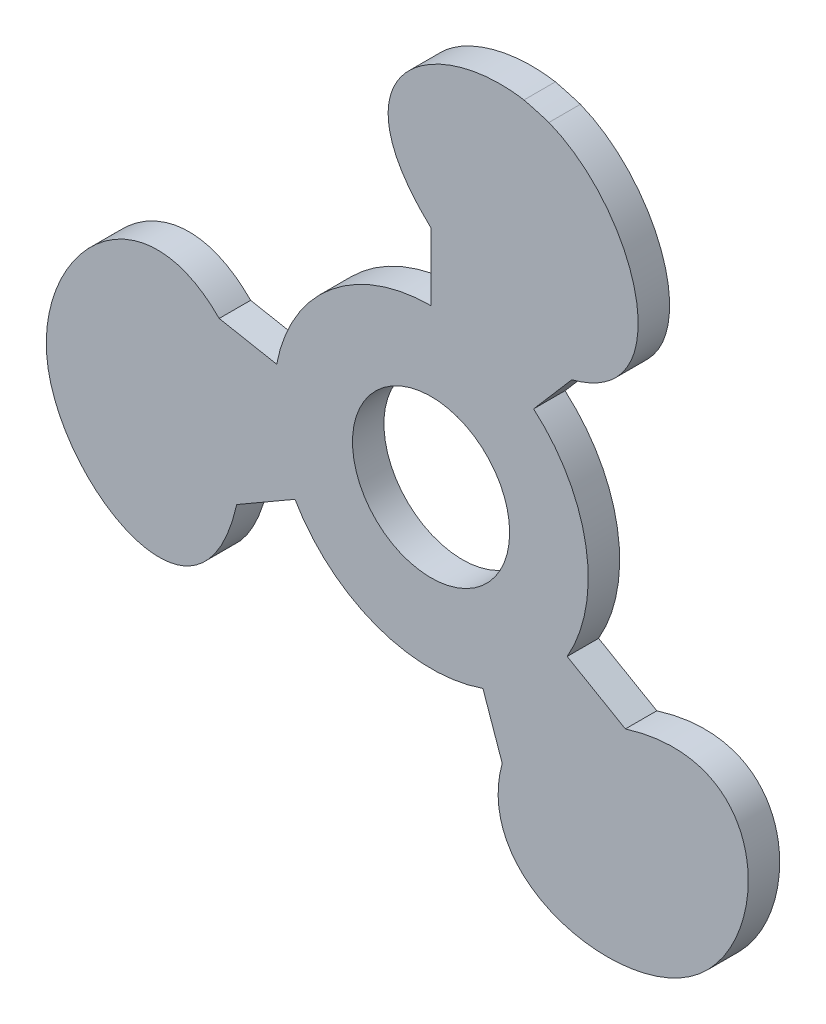
ISO-10303-21;
HEADER;
FILE_DESCRIPTION(('STEP AP214'),'2;1');
FILE_NAME('part.step','',(''),(''),'','','');
FILE_SCHEMA(('AUTOMOTIVE_DESIGN { 1 0 10303 214 1 1 1 1 }'));
ENDSEC;
DATA;
#1=APPLICATION_CONTEXT('core data for automotive mechanical design processes');
#2=APPLICATION_PROTOCOL_DEFINITION('international standard','automotive_design',2000,#1);
#3=PRODUCT_CONTEXT('',#1,'mechanical');
#4=PRODUCT('Part','Part','',(#3));
#5=PRODUCT_RELATED_PRODUCT_CATEGORY('part','',(#4));
#6=PRODUCT_DEFINITION_FORMATION('','',#4);
#7=PRODUCT_DEFINITION_CONTEXT('part definition',#1,'design');
#8=PRODUCT_DEFINITION('design','',#6,#7);
#9=PRODUCT_DEFINITION_SHAPE('','',#8);
#10=(LENGTH_UNIT() NAMED_UNIT(*) SI_UNIT(.MILLI.,.METRE.));
#11=(NAMED_UNIT(*) PLANE_ANGLE_UNIT() SI_UNIT($,.RADIAN.));
#12=(NAMED_UNIT(*) SI_UNIT($,.STERADIAN.) SOLID_ANGLE_UNIT());
#13=UNCERTAINTY_MEASURE_WITH_UNIT(LENGTH_MEASURE(1.E-05),#10,'distance_accuracy_value','');
#14=(GEOMETRIC_REPRESENTATION_CONTEXT(3) GLOBAL_UNCERTAINTY_ASSIGNED_CONTEXT((#13)) GLOBAL_UNIT_ASSIGNED_CONTEXT((#10,
#11,#12)) REPRESENTATION_CONTEXT('',''));
#15=CARTESIAN_POINT('',(0.,0.,0.));
#16=DIRECTION('',(0.,0.,1.));
#17=DIRECTION('',(1.,0.,0.));
#18=AXIS2_PLACEMENT_3D('',#15,#16,#17);
#19=CARTESIAN_POINT('',(-12.3652752127292,-7.13909497267301,2.));
#20=CARTESIAN_POINT('',(-14.5541537124351,-16.7940340003623,2.));
#21=CARTESIAN_POINT('',(-32.1296212357501,-6.76288989126732,2.));
#22=CARTESIAN_POINT('',(-18.6748872451603,7.80691112905887,2.));
#23=CARTESIAN_POINT('',(-13.4821589356845,2.5563717386839,2.));
#24=B_SPLINE_CURVE_WITH_KNOTS('',3,(#19,#20,#21,#22,#23),.UNSPECIFIED.,.F.,.F.,(4,1,4),(0.,
0.508066185754946,1.),.UNSPECIFIED.);
#25=DIRECTION('',(0.,0.,-1.));
#26=VECTOR('',#25,1.);
#27=SURFACE_OF_LINEAR_EXTRUSION('',#24,#26);
#28=CARTESIAN_POINT('',(-12.3652752127292,-7.13909497267301,0.));
#29=CARTESIAN_POINT('',(-14.5541537124351,-16.7940340003623,0.));
#30=CARTESIAN_POINT('',(-32.1296212357501,-6.76288989126732,0.));
#31=CARTESIAN_POINT('',(-18.6748872451603,7.80691112905887,0.));
#32=CARTESIAN_POINT('',(-13.4821589356845,2.5563717386839,0.));
#33=B_SPLINE_CURVE_WITH_KNOTS('',3,(#28,#29,#30,#31,#32),.UNSPECIFIED.,.F.,.F.,(4,1,4),(0.,
0.508066185754946,1.),.UNSPECIFIED.);
#34=CARTESIAN_POINT('',(-12.3652752127292,-7.13909497267301,0.));
#35=VERTEX_POINT('',#34);
#36=CARTESIAN_POINT('',(-13.4821589356845,2.5563717386839,0.));
#37=VERTEX_POINT('',#36);
#38=EDGE_CURVE('E151',#35,#37,#33,.T.);
#39=ORIENTED_EDGE('',*,*,#38,.F.);
#40=DIRECTION('',(0.,0.,-1.));
#41=VECTOR('',#40,1.);
#42=CARTESIAN_POINT('',(-12.3652752127292,-7.13909497267301,2.));
#43=LINE('',#42,#41);
#44=CARTESIAN_POINT('',(-12.3652752127292,-7.13909497267301,2.));
#45=VERTEX_POINT('',#44);
#46=EDGE_CURVE('E11',#45,#35,#43,.T.);
#47=ORIENTED_EDGE('',*,*,#46,.F.);
#48=CARTESIAN_POINT('',(-13.4821589356845,2.5563717386839,2.));
#49=VERTEX_POINT('',#48);
#50=EDGE_CURVE('E146',#45,#49,#24,.T.);
#51=ORIENTED_EDGE('',*,*,#50,.T.);
#52=DIRECTION('',(0.,0.,-1.));
#53=VECTOR('',#52,1.);
#54=CARTESIAN_POINT('',(-13.4821589356845,2.5563717386839,2.));
#55=LINE('',#54,#53);
#56=EDGE_CURVE('E358',#49,#37,#55,.T.);
#57=ORIENTED_EDGE('',*,*,#56,.T.);
#58=EDGE_LOOP('',(#39,#47,#51,#57));
#59=FACE_BOUND('',#58,.T.);
#60=ADVANCED_FACE('F35',(#59),#27,.T.);
#61=CARTESIAN_POINT('',(0.,0.,2.));
#62=DIRECTION('',(0.5,-0.866025403784439,0.));
#63=DIRECTION('',(0.866025403784439,0.5,0.));
#64=AXIS2_PLACEMENT_3D('',#61,#62,#63);
#65=PLANE('',#64);
#66=DIRECTION('',(0.,0.,1.));
#67=VECTOR('',#66,1.);
#68=CARTESIAN_POINT('',(-8.66025403784439,-5.,0.));
#69=LINE('',#68,#67);
#70=CARTESIAN_POINT('',(-8.66025403784439,-5.,2.));
#71=VERTEX_POINT('',#70);
#72=CARTESIAN_POINT('',(-8.66025403784439,-5.,0.));
#73=VERTEX_POINT('',#72);
#74=EDGE_CURVE('E140',#71,#73,#69,.F.);
#75=ORIENTED_EDGE('',*,*,#74,.F.);
#76=DIRECTION('',(-0.866025403784439,-0.5,0.));
#77=VECTOR('',#76,1.);
#78=CARTESIAN_POINT('',(0.,0.,2.));
#79=LINE('',#78,#77);
#80=EDGE_CURVE('E135',#71,#45,#79,.T.);
#81=ORIENTED_EDGE('',*,*,#80,.T.);
#82=ORIENTED_EDGE('',*,*,#46,.T.);
#83=DIRECTION('',(-0.866025403784439,-0.5,0.));
#84=VECTOR('',#83,1.);
#85=CARTESIAN_POINT('',(0.,0.,0.));
#86=LINE('',#85,#84);
#87=EDGE_CURVE('E362',#73,#35,#86,.T.);
#88=ORIENTED_EDGE('',*,*,#87,.F.);
#89=EDGE_LOOP('',(#75,#81,#82,#88));
#90=FACE_BOUND('',#89,.T.);
#91=ADVANCED_FACE('F137',(#90),#65,.T.);
#92=CARTESIAN_POINT('',(0.,0.,2.));
#93=DIRECTION('',(-0.944011192247635,-0.329913426388195,0.));
#94=DIRECTION('',(0.329913426388196,-0.944011192247635,0.));
#95=AXIS2_PLACEMENT_3D('',#92,#93,#94);
#96=PLANE('',#95);
#97=DIRECTION('',(0.,0.,1.));
#98=VECTOR('',#97,1.);
#99=CARTESIAN_POINT('',(3.29913426388195,-9.44011192247635,0.));
#100=LINE('',#99,#98);
#101=CARTESIAN_POINT('',(3.29913426388195,-9.44011192247635,0.));
#102=VERTEX_POINT('',#101);
#103=CARTESIAN_POINT('',(3.29913426388195,-9.44011192247635,2.));
#104=VERTEX_POINT('',#103);
#105=EDGE_CURVE('E414',#102,#104,#100,.T.);
#106=ORIENTED_EDGE('',*,*,#105,.F.);
#107=DIRECTION('',(-0.329913426388196,0.944011192247635,0.));
#108=VECTOR('',#107,1.);
#109=CARTESIAN_POINT('',(0.,0.,0.));
#110=LINE('',#109,#108);
#111=CARTESIAN_POINT('',(4.5271966006254,-12.9540780055041,0.));
#112=VERTEX_POINT('',#111);
#113=EDGE_CURVE('E367',#112,#102,#110,.T.);
#114=ORIENTED_EDGE('',*,*,#113,.F.);
#115=DIRECTION('',(0.,0.,-1.));
#116=VECTOR('',#115,1.);
#117=CARTESIAN_POINT('',(4.5271966006254,-12.9540780055041,2.));
#118=LINE('',#117,#116);
#119=CARTESIAN_POINT('',(4.5271966006254,-12.9540780055041,2.));
#120=VERTEX_POINT('',#119);
#121=EDGE_CURVE('E43',#120,#112,#118,.T.);
#122=ORIENTED_EDGE('',*,*,#121,.F.);
#123=DIRECTION('',(-0.329913426388196,0.944011192247635,0.));
#124=VECTOR('',#123,1.);
#125=CARTESIAN_POINT('',(0.,0.,2.));
#126=LINE('',#125,#124);
#127=EDGE_CURVE('E145',#120,#104,#126,.T.);
#128=ORIENTED_EDGE('',*,*,#127,.T.);
#129=EDGE_LOOP('',(#106,#114,#122,#128));
#130=FACE_BOUND('',#129,.T.);
#131=ADVANCED_FACE('F185',(#130),#96,.T.);
#132=CARTESIAN_POINT('',(12.3652752127292,-7.13909497267302,2.));
#133=CARTESIAN_POINT('',(21.821136932551,-4.20724984537113,2.));
#134=CARTESIAN_POINT('',(21.9216450667096,-24.4436232584978,2.));
#135=CARTESIAN_POINT('',(2.57646025972784,-20.0763823316482,2.));
#136=CARTESIAN_POINT('',(4.5271966006254,-12.9540780055041,2.));
#137=B_SPLINE_CURVE_WITH_KNOTS('',3,(#132,#133,#134,#135,#136),.UNSPECIFIED.,.F.,.F.,(4,1,4),
(0.,0.508066185754946,1.),.UNSPECIFIED.);
#138=DIRECTION('',(0.,0.,-1.));
#139=VECTOR('',#138,1.);
#140=SURFACE_OF_LINEAR_EXTRUSION('',#137,#139);
#141=CARTESIAN_POINT('',(12.3652752127292,-7.13909497267302,0.));
#142=CARTESIAN_POINT('',(21.821136932551,-4.20724984537113,0.));
#143=CARTESIAN_POINT('',(21.9216450667096,-24.4436232584978,0.));
#144=CARTESIAN_POINT('',(2.57646025972784,-20.0763823316482,0.));
#145=CARTESIAN_POINT('',(4.5271966006254,-12.9540780055041,0.));
#146=B_SPLINE_CURVE_WITH_KNOTS('',3,(#141,#142,#143,#144,#145),.UNSPECIFIED.,.F.,.F.,(4,1,4),
(0.,0.508066185754946,1.),.UNSPECIFIED.);
#147=CARTESIAN_POINT('',(12.3652752127292,-7.13909497267302,0.));
#148=VERTEX_POINT('',#147);
#149=EDGE_CURVE('E370',#148,#112,#146,.T.);
#150=ORIENTED_EDGE('',*,*,#149,.F.);
#151=DIRECTION('',(0.,0.,-1.));
#152=VECTOR('',#151,1.);
#153=CARTESIAN_POINT('',(12.3652752127292,-7.13909497267302,2.));
#154=LINE('',#153,#152);
#155=CARTESIAN_POINT('',(12.3652752127292,-7.13909497267302,2.));
#156=VERTEX_POINT('',#155);
#157=EDGE_CURVE('E406',#156,#148,#154,.T.);
#158=ORIENTED_EDGE('',*,*,#157,.F.);
#159=EDGE_CURVE('E168',#156,#120,#137,.T.);
#160=ORIENTED_EDGE('',*,*,#159,.T.);
#161=ORIENTED_EDGE('',*,*,#121,.T.);
#162=EDGE_LOOP('',(#150,#158,#160,#161));
#163=FACE_BOUND('',#162,.T.);
#164=ADVANCED_FACE('F180',(#163),#140,.T.);
#165=CARTESIAN_POINT('',(0.,0.,2.));
#166=DIRECTION('',(0.5,0.866025403784438,0.));
#167=DIRECTION('',(-0.866025403784438,0.5,0.));
#168=AXIS2_PLACEMENT_3D('',#165,#166,#167);
#169=PLANE('',#168);
#170=DIRECTION('',(0.,0.,1.));
#171=VECTOR('',#170,1.);
#172=CARTESIAN_POINT('',(8.66025403784439,-5.,0.));
#173=LINE('',#172,#171);
#174=CARTESIAN_POINT('',(8.66025403784439,-5.,2.));
#175=VERTEX_POINT('',#174);
#176=CARTESIAN_POINT('',(8.66025403784439,-5.,0.));
#177=VERTEX_POINT('',#176);
#178=EDGE_CURVE('E427',#175,#177,#173,.F.);
#179=ORIENTED_EDGE('',*,*,#178,.F.);
#180=DIRECTION('',(0.866025403784438,-0.5,0.));
#181=VECTOR('',#180,1.);
#182=CARTESIAN_POINT('',(0.,0.,2.));
#183=LINE('',#182,#181);
#184=EDGE_CURVE('E174',#175,#156,#183,.T.);
#185=ORIENTED_EDGE('',*,*,#184,.T.);
#186=ORIENTED_EDGE('',*,*,#157,.T.);
#187=DIRECTION('',(0.866025403784438,-0.5,0.));
#188=VECTOR('',#187,1.);
#189=CARTESIAN_POINT('',(0.,0.,0.));
#190=LINE('',#189,#188);
#191=EDGE_CURVE('E375',#177,#148,#190,.T.);
#192=ORIENTED_EDGE('',*,*,#191,.F.);
#193=EDGE_LOOP('',(#179,#185,#186,#192));
#194=FACE_BOUND('',#193,.T.);
#195=ADVANCED_FACE('F184',(#194),#169,.T.);
#196=CARTESIAN_POINT('',(4.45592768412916E-13,-3.83764106767014E-13,2.));
#197=DIRECTION('',(0.75771900442559,-0.652580960749157,0.));
#198=DIRECTION('',(0.652580960749157,0.75771900442559,0.));
#199=AXIS2_PLACEMENT_3D('',#196,#197,#198);
#200=PLANE('',#199);
#201=DIRECTION('',(0.,0.,1.));
#202=VECTOR('',#201,1.);
#203=CARTESIAN_POINT('',(6.52580960749202,7.57719004425552,0.));
#204=LINE('',#203,#202);
#205=CARTESIAN_POINT('',(6.52580960749202,7.57719004425552,0.));
#206=VERTEX_POINT('',#205);
#207=CARTESIAN_POINT('',(6.52580960749202,7.57719004425552,2.));
#208=VERTEX_POINT('',#207);
#209=EDGE_CURVE('E428',#206,#208,#204,.T.);
#210=ORIENTED_EDGE('',*,*,#209,.F.);
#211=DIRECTION('',(-0.652580960749157,-0.75771900442559,0.));
#212=VECTOR('',#211,1.);
#213=CARTESIAN_POINT('',(4.45592768412916E-13,-3.83764106767014E-13,0.));
#214=LINE('',#213,#212);
#215=CARTESIAN_POINT('',(8.95496233505911,10.3977062668202,0.));
#216=VERTEX_POINT('',#215);
#217=EDGE_CURVE('E380',#216,#206,#214,.T.);
#218=ORIENTED_EDGE('',*,*,#217,.F.);
#219=DIRECTION('',(0.,0.,-1.));
#220=VECTOR('',#219,1.);
#221=CARTESIAN_POINT('',(8.95496233505911,10.3977062668202,2.));
#222=LINE('',#221,#220);
#223=CARTESIAN_POINT('',(8.95496233505911,10.3977062668202,2.));
#224=VERTEX_POINT('',#223);
#225=EDGE_CURVE('E404',#224,#216,#222,.T.);
#226=ORIENTED_EDGE('',*,*,#225,.F.);
#227=DIRECTION('',(-0.652580960749157,-0.75771900442559,0.));
#228=VECTOR('',#227,1.);
#229=CARTESIAN_POINT('',(4.45592768412916E-13,-3.83764106767014E-13,2.));
#230=LINE('',#229,#228);
#231=EDGE_CURVE('E349',#224,#208,#230,.T.);
#232=ORIENTED_EDGE('',*,*,#231,.T.);
#233=EDGE_LOOP('',(#210,#218,#226,#232));
#234=FACE_BOUND('',#233,.T.);
#235=ADVANCED_FACE('F217',(#234),#200,.T.);
#236=CARTESIAN_POINT('',(0.,14.278189945346,2.));
#237=CARTESIAN_POINT('',(-7.26698322011607,21.0012838457335,2.));
#238=CARTESIAN_POINT('',(10.2079761690403,31.2065131497653,2.));
#239=CARTESIAN_POINT('',(16.0984269854324,12.2694712025896,2.));
#240=CARTESIAN_POINT('',(8.95496233505912,10.3977062668202,2.));
#241=B_SPLINE_CURVE_WITH_KNOTS('',3,(#236,#237,#238,#239,#240),.UNSPECIFIED.,.F.,.F.,(4,1,4),
(0.,0.508066185754947,1.),.UNSPECIFIED.);
#242=DIRECTION('',(0.,0.,-1.));
#243=VECTOR('',#242,1.);
#244=SURFACE_OF_LINEAR_EXTRUSION('',#241,#243);
#245=CARTESIAN_POINT('',(0.,14.278189945346,0.));
#246=CARTESIAN_POINT('',(-7.26698322011607,21.0012838457335,0.));
#247=CARTESIAN_POINT('',(10.2079761690403,31.2065131497653,0.));
#248=CARTESIAN_POINT('',(16.0984269854324,12.2694712025896,0.));
#249=CARTESIAN_POINT('',(8.95496233505912,10.3977062668202,0.));
#250=B_SPLINE_CURVE_WITH_KNOTS('',3,(#245,#246,#247,#248,#249),.UNSPECIFIED.,.F.,.F.,(4,1,4),
(0.,0.508066185754947,1.),.UNSPECIFIED.);
#251=CARTESIAN_POINT('',(7.49956503784142,23.8486168203354,0.));
#252=VERTEX_POINT('',#251);
#253=EDGE_CURVE('E383',#252,#216,#250,.T.);
#254=ORIENTED_EDGE('',*,*,#253,.F.);
#255=DIRECTION('',(0.,0.,-1.));
#256=VECTOR('',#255,1.);
#257=CARTESIAN_POINT('',(7.49956503784142,23.8486168203354,2.));
#258=LINE('',#257,#256);
#259=CARTESIAN_POINT('',(7.49956503784142,23.8486168203354,2.));
#260=VERTEX_POINT('',#259);
#261=EDGE_CURVE('E402',#260,#252,#258,.T.);
#262=ORIENTED_EDGE('',*,*,#261,.F.);
#263=EDGE_CURVE('E342',#260,#224,#241,.T.);
#264=ORIENTED_EDGE('',*,*,#263,.T.);
#265=ORIENTED_EDGE('',*,*,#225,.T.);
#266=EDGE_LOOP('',(#254,#262,#264,#265));
#267=FACE_BOUND('',#266,.T.);
#268=ADVANCED_FACE('F211',(#267),#244,.T.);
#269=CARTESIAN_POINT('',(0.,0.,2.));
#270=DIRECTION('',(0.,0.,-1.));
#271=DIRECTION('',(-1.,0.,0.));
#272=AXIS2_PLACEMENT_3D('',#269,#270,#271);
#273=CYLINDRICAL_SURFACE('',#272,25.);
#274=CARTESIAN_POINT('',(0.,0.,0.));
#275=DIRECTION('',(0.,0.,1.));
#276=DIRECTION('',(1.,0.,0.));
#277=AXIS2_PLACEMENT_3D('',#274,#275,#276);
#278=CIRCLE('',#277,25.);
#279=CARTESIAN_POINT('',(5.90962921394711,24.2914858037474,0.));
#280=VERTEX_POINT('',#279);
#281=EDGE_CURVE('E388',#252,#280,#278,.T.);
#282=ORIENTED_EDGE('',*,*,#281,.T.);
#283=DIRECTION('',(0.,0.,-1.));
#284=VECTOR('',#283,1.);
#285=CARTESIAN_POINT('',(5.90962921394711,24.2914858037474,2.));
#286=LINE('',#285,#284);
#287=CARTESIAN_POINT('',(5.90962921394711,24.2914858037474,2.));
#288=VERTEX_POINT('',#287);
#289=EDGE_CURVE('E400',#288,#280,#286,.T.);
#290=ORIENTED_EDGE('',*,*,#289,.F.);
#291=CARTESIAN_POINT('',(0.,0.,2.));
#292=DIRECTION('',(0.,0.,1.));
#293=DIRECTION('',(1.,0.,0.));
#294=AXIS2_PLACEMENT_3D('',#291,#292,#293);
#295=CIRCLE('',#294,25.);
#296=EDGE_CURVE('E348',#260,#288,#295,.T.);
#297=ORIENTED_EDGE('',*,*,#296,.F.);
#298=ORIENTED_EDGE('',*,*,#261,.T.);
#299=EDGE_LOOP('',(#282,#290,#297,#298));
#300=FACE_BOUND('',#299,.T.);
#301=ADVANCED_FACE('F216',(#300),#273,.T.);
#302=CARTESIAN_POINT('',(0.,14.2781899453455,0.));
#303=VERTEX_POINT('',#302);
#304=EDGE_CURVE('E389',#303,#280,#250,.T.);
#305=ORIENTED_EDGE('',*,*,#304,.F.);
#306=DIRECTION('',(0.,0.,-1.));
#307=VECTOR('',#306,1.);
#308=CARTESIAN_POINT('',(0.,14.2781899453455,2.));
#309=LINE('',#308,#307);
#310=CARTESIAN_POINT('',(0.,14.2781899453455,2.));
#311=VERTEX_POINT('',#310);
#312=EDGE_CURVE('E397',#311,#303,#309,.T.);
#313=ORIENTED_EDGE('',*,*,#312,.F.);
#314=EDGE_CURVE('E350',#311,#288,#241,.T.);
#315=ORIENTED_EDGE('',*,*,#314,.T.);
#316=ORIENTED_EDGE('',*,*,#289,.T.);
#317=EDGE_LOOP('',(#305,#313,#315,#316));
#318=FACE_BOUND('',#317,.T.);
#319=ADVANCED_FACE('F220',(#318),#244,.T.);
#320=CARTESIAN_POINT('',(0.,0.,2.));
#321=DIRECTION('',(-1.,0.,0.));
#322=DIRECTION('',(0.,0.,1.));
#323=AXIS2_PLACEMENT_3D('',#320,#321,#322);
#324=PLANE('',#323);
#325=DIRECTION('',(0.,0.,1.));
#326=VECTOR('',#325,1.);
#327=CARTESIAN_POINT('',(0.,10.,0.));
#328=LINE('',#327,#326);
#329=CARTESIAN_POINT('',(0.,10.,2.));
#330=VERTEX_POINT('',#329);
#331=CARTESIAN_POINT('',(0.,10.,0.));
#332=VERTEX_POINT('',#331);
#333=EDGE_CURVE('E58',#330,#332,#328,.F.);
#334=ORIENTED_EDGE('',*,*,#333,.F.);
#335=DIRECTION('',(0.,1.,0.));
#336=VECTOR('',#335,1.);
#337=CARTESIAN_POINT('',(0.,0.,2.));
#338=LINE('',#337,#336);
#339=EDGE_CURVE('E355',#330,#311,#338,.T.);
#340=ORIENTED_EDGE('',*,*,#339,.T.);
#341=ORIENTED_EDGE('',*,*,#312,.T.);
#342=DIRECTION('',(0.,1.,0.));
#343=VECTOR('',#342,1.);
#344=CARTESIAN_POINT('',(0.,0.,0.));
#345=LINE('',#344,#343);
#346=EDGE_CURVE('E156',#332,#303,#345,.T.);
#347=ORIENTED_EDGE('',*,*,#346,.F.);
#348=EDGE_LOOP('',(#334,#340,#341,#347));
#349=FACE_BOUND('',#348,.T.);
#350=ADVANCED_FACE('F238',(#349),#324,.T.);
#351=CARTESIAN_POINT('',(0.,0.,2.));
#352=DIRECTION('',(0.186292187822073,0.982494387137385,0.));
#353=DIRECTION('',(-0.982494387137385,0.186292187822073,0.));
#354=AXIS2_PLACEMENT_3D('',#351,#352,#353);
#355=PLANE('',#354);
#356=DIRECTION('',(0.,0.,1.));
#357=VECTOR('',#356,1.);
#358=CARTESIAN_POINT('',(-9.82494387137385,1.86292187822073,0.));
#359=LINE('',#358,#357);
#360=CARTESIAN_POINT('',(-9.82494387137385,1.86292187822073,0.));
#361=VERTEX_POINT('',#360);
#362=CARTESIAN_POINT('',(-9.82494387137385,1.86292187822073,2.));
#363=VERTEX_POINT('',#362);
#364=EDGE_CURVE('E434',#361,#363,#359,.T.);
#365=ORIENTED_EDGE('',*,*,#364,.F.);
#366=DIRECTION('',(0.982494387137385,-0.186292187822073,0.));
#367=VECTOR('',#366,1.);
#368=CARTESIAN_POINT('',(0.,0.,0.));
#369=LINE('',#368,#367);
#370=EDGE_CURVE('E154',#37,#361,#369,.T.);
#371=ORIENTED_EDGE('',*,*,#370,.F.);
#372=ORIENTED_EDGE('',*,*,#56,.F.);
#373=DIRECTION('',(0.982494387137385,-0.186292187822073,0.));
#374=VECTOR('',#373,1.);
#375=CARTESIAN_POINT('',(0.,0.,2.));
#376=LINE('',#375,#374);
#377=EDGE_CURVE('E50',#49,#363,#376,.T.);
#378=ORIENTED_EDGE('',*,*,#377,.T.);
#379=EDGE_LOOP('',(#365,#371,#372,#378));
#380=FACE_BOUND('',#379,.T.);
#381=ADVANCED_FACE('F268',(#380),#355,.T.);
#382=CARTESIAN_POINT('',(0.,0.,2.));
#383=DIRECTION('',(0.,0.,1.));
#384=DIRECTION('',(1.,0.,0.));
#385=AXIS2_PLACEMENT_3D('',#382,#383,#384);
#386=PLANE('',#385);
#387=CARTESIAN_POINT('',(0.,0.,2.));
#388=DIRECTION('',(0.,0.,1.));
#389=DIRECTION('',(1.,0.,0.));
#390=AXIS2_PLACEMENT_3D('',#387,#388,#389);
#391=CIRCLE('',#390,5.);
#392=CARTESIAN_POINT('',(5.,0.,2.));
#393=VERTEX_POINT('',#392);
#394=EDGE_CURVE('E442',#393,#393,#391,.T.);
#395=ORIENTED_EDGE('',*,*,#394,.F.);
#396=EDGE_LOOP('',(#395));
#397=FACE_BOUND('',#396,.T.);
#398=ORIENTED_EDGE('',*,*,#80,.F.);
#399=CARTESIAN_POINT('',(0.,0.,2.));
#400=DIRECTION('',(0.,0.,1.));
#401=DIRECTION('',(1.,0.,0.));
#402=AXIS2_PLACEMENT_3D('',#399,#400,#401);
#403=CIRCLE('',#402,10.);
#404=EDGE_CURVE('E425',#71,#104,#403,.T.);
#405=ORIENTED_EDGE('',*,*,#404,.T.);
#406=ORIENTED_EDGE('',*,*,#127,.F.);
#407=ORIENTED_EDGE('',*,*,#159,.F.);
#408=ORIENTED_EDGE('',*,*,#184,.F.);
#409=EDGE_CURVE('E437',#175,#208,#403,.T.);
#410=ORIENTED_EDGE('',*,*,#409,.T.);
#411=ORIENTED_EDGE('',*,*,#231,.F.);
#412=ORIENTED_EDGE('',*,*,#263,.F.);
#413=ORIENTED_EDGE('',*,*,#296,.T.);
#414=ORIENTED_EDGE('',*,*,#314,.F.);
#415=ORIENTED_EDGE('',*,*,#339,.F.);
#416=EDGE_CURVE('E440',#330,#363,#403,.T.);
#417=ORIENTED_EDGE('',*,*,#416,.T.);
#418=ORIENTED_EDGE('',*,*,#377,.F.);
#419=ORIENTED_EDGE('',*,*,#50,.F.);
#420=EDGE_LOOP('',(#398,#405,#406,#407,#408,#410,#411,#412,#413,#414,#415,#417,#418,#419));
#421=FACE_BOUND('',#420,.T.);
#422=ADVANCED_FACE('F152',(#397,#421),#386,.T.);
#423=CARTESIAN_POINT('',(0.,0.,0.));
#424=DIRECTION('',(0.,0.,1.));
#425=DIRECTION('',(1.,0.,0.));
#426=AXIS2_PLACEMENT_3D('',#423,#424,#425);
#427=PLANE('',#426);
#428=CARTESIAN_POINT('',(0.,0.,0.));
#429=DIRECTION('',(0.,0.,1.));
#430=DIRECTION('',(1.,0.,0.));
#431=AXIS2_PLACEMENT_3D('',#428,#429,#430);
#432=CIRCLE('',#431,5.);
#433=CARTESIAN_POINT('',(5.,0.,0.));
#434=VERTEX_POINT('',#433);
#435=EDGE_CURVE('E439',#434,#434,#432,.T.);
#436=ORIENTED_EDGE('',*,*,#435,.T.);
#437=EDGE_LOOP('',(#436));
#438=FACE_BOUND('',#437,.T.);
#439=CARTESIAN_POINT('',(0.,0.,0.));
#440=DIRECTION('',(0.,0.,1.));
#441=DIRECTION('',(1.,0.,0.));
#442=AXIS2_PLACEMENT_3D('',#439,#440,#441);
#443=CIRCLE('',#442,10.);
#444=EDGE_CURVE('E426',#73,#102,#443,.T.);
#445=ORIENTED_EDGE('',*,*,#444,.F.);
#446=ORIENTED_EDGE('',*,*,#87,.T.);
#447=ORIENTED_EDGE('',*,*,#38,.T.);
#448=ORIENTED_EDGE('',*,*,#370,.T.);
#449=EDGE_CURVE('E436',#332,#361,#443,.T.);
#450=ORIENTED_EDGE('',*,*,#449,.F.);
#451=ORIENTED_EDGE('',*,*,#346,.T.);
#452=ORIENTED_EDGE('',*,*,#304,.T.);
#453=ORIENTED_EDGE('',*,*,#281,.F.);
#454=ORIENTED_EDGE('',*,*,#253,.T.);
#455=ORIENTED_EDGE('',*,*,#217,.T.);
#456=EDGE_CURVE('E420',#177,#206,#443,.T.);
#457=ORIENTED_EDGE('',*,*,#456,.F.);
#458=ORIENTED_EDGE('',*,*,#191,.T.);
#459=ORIENTED_EDGE('',*,*,#149,.T.);
#460=ORIENTED_EDGE('',*,*,#113,.T.);
#461=EDGE_LOOP('',(#445,#446,#447,#448,#450,#451,#452,#453,#454,#455,#457,#458,#459,#460));
#462=FACE_BOUND('',#461,.T.);
#463=ADVANCED_FACE('F289',(#438,#462),#427,.F.);
#464=CARTESIAN_POINT('',(0.,0.,0.));
#465=DIRECTION('',(0.,0.,1.));
#466=DIRECTION('',(1.,0.,0.));
#467=AXIS2_PLACEMENT_3D('',#464,#465,#466);
#468=CYLINDRICAL_SURFACE('',#467,10.);
#469=ORIENTED_EDGE('',*,*,#416,.F.);
#470=ORIENTED_EDGE('',*,*,#333,.T.);
#471=ORIENTED_EDGE('',*,*,#449,.T.);
#472=ORIENTED_EDGE('',*,*,#364,.T.);
#473=EDGE_LOOP('',(#469,#470,#471,#472));
#474=FACE_BOUND('',#473,.T.);
#475=ADVANCED_FACE('F283',(#474),#468,.T.);
#476=ORIENTED_EDGE('',*,*,#409,.F.);
#477=ORIENTED_EDGE('',*,*,#178,.T.);
#478=ORIENTED_EDGE('',*,*,#456,.T.);
#479=ORIENTED_EDGE('',*,*,#209,.T.);
#480=EDGE_LOOP('',(#476,#477,#478,#479));
#481=FACE_BOUND('',#480,.T.);
#482=ADVANCED_FACE('F288',(#481),#468,.T.);
#483=ORIENTED_EDGE('',*,*,#404,.F.);
#484=ORIENTED_EDGE('',*,*,#74,.T.);
#485=ORIENTED_EDGE('',*,*,#444,.T.);
#486=ORIENTED_EDGE('',*,*,#105,.T.);
#487=EDGE_LOOP('',(#483,#484,#485,#486));
#488=FACE_BOUND('',#487,.T.);
#489=ADVANCED_FACE('F292',(#488),#468,.T.);
#490=CARTESIAN_POINT('',(0.,0.,0.));
#491=DIRECTION('',(0.,0.,1.));
#492=DIRECTION('',(1.,0.,0.));
#493=AXIS2_PLACEMENT_3D('',#490,#491,#492);
#494=CYLINDRICAL_SURFACE('',#493,5.);
#495=ORIENTED_EDGE('',*,*,#435,.F.);
#496=EDGE_LOOP('',(#495));
#497=FACE_BOUND('',#496,.T.);
#498=ORIENTED_EDGE('',*,*,#394,.T.);
#499=EDGE_LOOP('',(#498));
#500=FACE_BOUND('',#499,.T.);
#501=ADVANCED_FACE('F310',(#497,#500),#494,.F.);
#502=CLOSED_SHELL('',(#60,#91,#131,#164,#195,#235,#268,#301,#319,#350,#381,#422,#463,#475,#482,
#489,#501));
#503=MANIFOLD_SOLID_BREP('B2',#502);
#504=ADVANCED_BREP_SHAPE_REPRESENTATION('',(#18,#503),#14);
#505=SHAPE_DEFINITION_REPRESENTATION(#9,#504);
ENDSEC;
END-ISO-10303-21;
